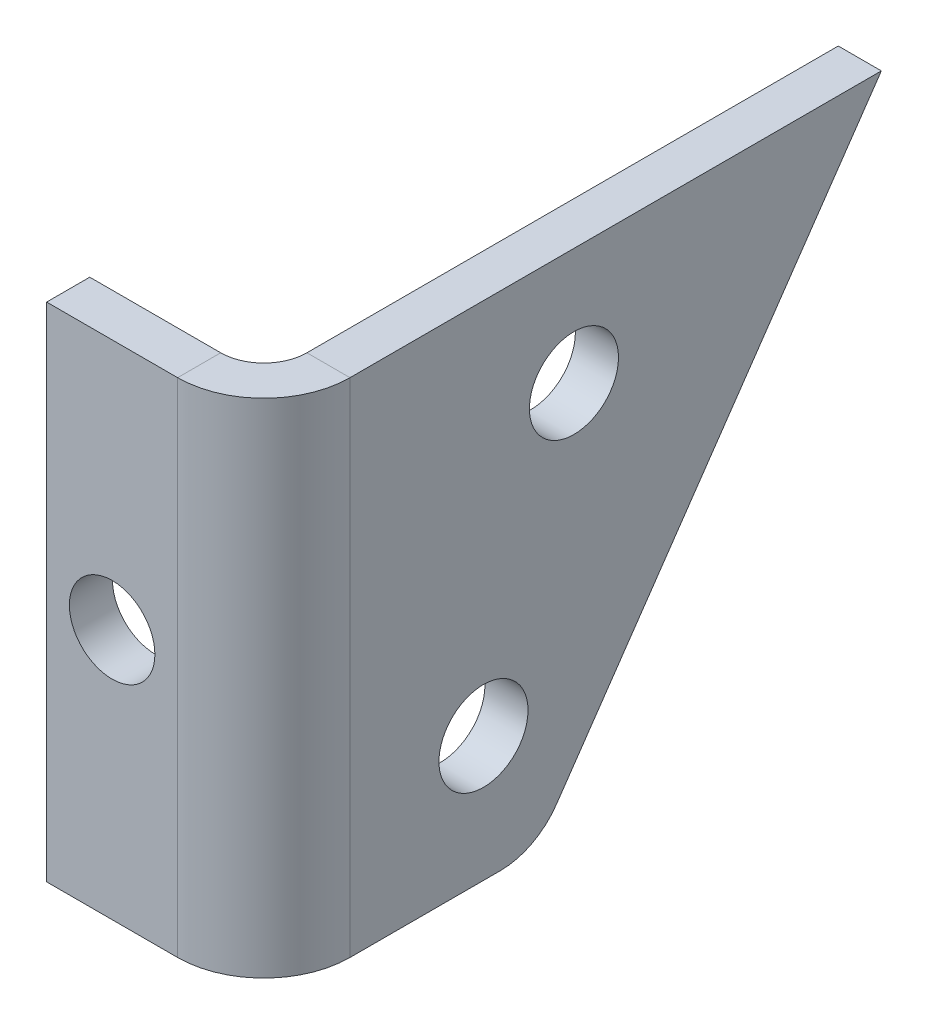
ISO-10303-21;
HEADER;
FILE_DESCRIPTION(('STEP AP214'),'2;1');
FILE_NAME('part.step','',(''),(''),'','','');
FILE_SCHEMA(('AUTOMOTIVE_DESIGN { 1 0 10303 214 1 1 1 1 }'));
ENDSEC;
DATA;
#1=APPLICATION_CONTEXT('core data for automotive mechanical design processes');
#2=APPLICATION_PROTOCOL_DEFINITION('international standard','automotive_design',2000,#1);
#3=PRODUCT_CONTEXT('',#1,'mechanical');
#4=PRODUCT('Part','Part','',(#3));
#5=PRODUCT_RELATED_PRODUCT_CATEGORY('part','',(#4));
#6=PRODUCT_DEFINITION_FORMATION('','',#4);
#7=PRODUCT_DEFINITION_CONTEXT('part definition',#1,'design');
#8=PRODUCT_DEFINITION('design','',#6,#7);
#9=PRODUCT_DEFINITION_SHAPE('','',#8);
#10=(LENGTH_UNIT() NAMED_UNIT(*) SI_UNIT(.MILLI.,.METRE.));
#11=(NAMED_UNIT(*) PLANE_ANGLE_UNIT() SI_UNIT($,.RADIAN.));
#12=(NAMED_UNIT(*) SI_UNIT($,.STERADIAN.) SOLID_ANGLE_UNIT());
#13=UNCERTAINTY_MEASURE_WITH_UNIT(LENGTH_MEASURE(1.E-05),#10,'distance_accuracy_value','');
#14=(GEOMETRIC_REPRESENTATION_CONTEXT(3) GLOBAL_UNCERTAINTY_ASSIGNED_CONTEXT((#13)) GLOBAL_UNIT_ASSIGNED_CONTEXT((#10,
#11,#12)) REPRESENTATION_CONTEXT('',''));
#15=CARTESIAN_POINT('',(0.,0.,0.));
#16=DIRECTION('',(0.,0.,1.));
#17=DIRECTION('',(1.,0.,0.));
#18=AXIS2_PLACEMENT_3D('',#15,#16,#17);
#19=CARTESIAN_POINT('',(-3.175,37.,-50.1590545460921));
#20=DIRECTION('',(0.,1.,0.));
#21=DIRECTION('',(0.,0.,1.));
#22=AXIS2_PLACEMENT_3D('',#19,#20,#21);
#23=PLANE('',#22);
#24=DIRECTION('',(0.,0.,1.));
#25=VECTOR('',#24,1.);
#26=CARTESIAN_POINT('',(-3.175,37.,-50.1590545460921));
#27=LINE('',#26,#25);
#28=CARTESIAN_POINT('',(-3.175,37.,-95.6605073025976));
#29=VERTEX_POINT('',#28);
#30=CARTESIAN_POINT('',(-3.17499999999999,37.,-56.5090545460921));
#31=VERTEX_POINT('',#30);
#32=EDGE_CURVE('E228',#29,#31,#27,.T.);
#33=ORIENTED_EDGE('',*,*,#32,.T.);
#34=DIRECTION('',(1.,0.,0.));
#35=VECTOR('',#34,1.);
#36=CARTESIAN_POINT('',(-3.17499999999999,37.,-56.5090545460921));
#37=LINE('',#36,#35);
#38=CARTESIAN_POINT('',(0.,37.,-56.5090545460921));
#39=VERTEX_POINT('',#38);
#40=EDGE_CURVE('E198',#31,#39,#37,.T.);
#41=ORIENTED_EDGE('',*,*,#40,.T.);
#42=DIRECTION('',(0.,0.,1.));
#43=VECTOR('',#42,1.);
#44=CARTESIAN_POINT('',(0.,37.,-50.1590545460921));
#45=LINE('',#44,#43);
#46=CARTESIAN_POINT('',(0.,37.,-95.6605073025976));
#47=VERTEX_POINT('',#46);
#48=EDGE_CURVE('E223',#47,#39,#45,.T.);
#49=ORIENTED_EDGE('',*,*,#48,.F.);
#50=DIRECTION('',(1.,0.,0.));
#51=VECTOR('',#50,1.);
#52=CARTESIAN_POINT('',(-3.175,37.,-95.6605073025976));
#53=LINE('',#52,#51);
#54=EDGE_CURVE('E13',#29,#47,#53,.T.);
#55=ORIENTED_EDGE('',*,*,#54,.F.);
#56=EDGE_LOOP('',(#33,#41,#49,#55));
#57=FACE_BOUND('',#56,.T.);
#58=ADVANCED_FACE('F63',(#57),#23,.T.);
#59=CARTESIAN_POINT('',(-3.175,5.00000000000016,-67.5979092718288));
#60=DIRECTION('',(1.,0.,0.));
#61=DIRECTION('',(0.,0.,-1.));
#62=AXIS2_PLACEMENT_3D('',#59,#60,#61);
#63=PLANE('',#62);
#64=CARTESIAN_POINT('',(-3.175,28.4055664108271,-73.0098549934206));
#65=DIRECTION('',(1.,0.,0.));
#66=DIRECTION('',(0.,0.,-1.));
#67=AXIS2_PLACEMENT_3D('',#64,#65,#66);
#68=CIRCLE('',#67,3.28245761780859);
#69=CARTESIAN_POINT('',(-3.175,28.4055664108271,-76.2923126112292));
#70=VERTEX_POINT('',#69);
#71=EDGE_CURVE('E215',#70,#70,#68,.T.);
#72=ORIENTED_EDGE('',*,*,#71,.T.);
#73=EDGE_LOOP('',(#72));
#74=FACE_BOUND('',#73,.T.);
#75=CARTESIAN_POINT('',(-3.175,9.22229452648841,-66.344990454787));
#76=DIRECTION('',(1.,0.,0.));
#77=DIRECTION('',(0.,0.,-1.));
#78=AXIS2_PLACEMENT_3D('',#75,#76,#77);
#79=CIRCLE('',#78,3.28245761780857);
#80=CARTESIAN_POINT('',(-3.175,9.22229452648841,-69.6274480725955));
#81=VERTEX_POINT('',#80);
#82=EDGE_CURVE('E209',#81,#81,#79,.T.);
#83=ORIENTED_EDGE('',*,*,#82,.T.);
#84=EDGE_LOOP('',(#83));
#85=FACE_BOUND('',#84,.T.);
#86=DIRECTION('',(0.,1.,0.));
#87=VECTOR('',#86,1.);
#88=CARTESIAN_POINT('',(-3.17499999999999,37.,-56.5090545460921));
#89=LINE('',#88,#87);
#90=CARTESIAN_POINT('',(-3.17499999999999,0.,-56.5090545460921));
#91=VERTEX_POINT('',#90);
#92=EDGE_CURVE('E202',#31,#91,#89,.F.);
#93=ORIENTED_EDGE('',*,*,#92,.F.);
#94=ORIENTED_EDGE('',*,*,#32,.F.);
#95=DIRECTION('',(0.,0.824097746308315,-0.566447618522274));
#96=VECTOR('',#95,1.);
#97=CARTESIAN_POINT('',(-3.175,2.16776190738873,-71.7183980033704));
#98=LINE('',#97,#96);
#99=CARTESIAN_POINT('',(-3.175,2.16776190738873,-71.7183980033704));
#100=VERTEX_POINT('',#99);
#101=EDGE_CURVE('E226',#100,#29,#98,.T.);
#102=ORIENTED_EDGE('',*,*,#101,.F.);
#103=CARTESIAN_POINT('',(-3.175,5.00000000000016,-67.5979092718288));
#104=DIRECTION('',(1.,0.,0.));
#105=DIRECTION('',(0.,0.,-1.));
#106=AXIS2_PLACEMENT_3D('',#103,#104,#105);
#107=CIRCLE('',#106,5.00000000000001);
#108=CARTESIAN_POINT('',(-3.175,1.47451495458029E-13,-67.5979092718288));
#109=VERTEX_POINT('',#108);
#110=EDGE_CURVE('E222',#109,#100,#107,.T.);
#111=ORIENTED_EDGE('',*,*,#110,.F.);
#112=DIRECTION('',(0.,0.,-1.));
#113=VECTOR('',#112,1.);
#114=CARTESIAN_POINT('',(-3.175,0.,-50.1590545460921));
#115=LINE('',#114,#113);
#116=EDGE_CURVE('E109',#91,#109,#115,.T.);
#117=ORIENTED_EDGE('',*,*,#116,.F.);
#118=EDGE_LOOP('',(#93,#94,#102,#111,#117));
#119=FACE_BOUND('',#118,.T.);
#120=ADVANCED_FACE('F251',(#74,#85,#119),#63,.F.);
#121=CARTESIAN_POINT('',(0.,5.00000000000016,-67.5979092718288));
#122=DIRECTION('',(1.,0.,0.));
#123=DIRECTION('',(0.,0.,-1.));
#124=AXIS2_PLACEMENT_3D('',#121,#122,#123);
#125=PLANE('',#124);
#126=CARTESIAN_POINT('',(0.,9.22229452648841,-66.344990454787));
#127=DIRECTION('',(1.,0.,0.));
#128=DIRECTION('',(0.,0.,-1.));
#129=AXIS2_PLACEMENT_3D('',#126,#127,#128);
#130=CIRCLE('',#129,3.28245761780857);
#131=CARTESIAN_POINT('',(0.,9.22229452648841,-69.6274480725955));
#132=VERTEX_POINT('',#131);
#133=EDGE_CURVE('E207',#132,#132,#130,.T.);
#134=ORIENTED_EDGE('',*,*,#133,.F.);
#135=EDGE_LOOP('',(#134));
#136=FACE_BOUND('',#135,.T.);
#137=CARTESIAN_POINT('',(0.,28.4055664108271,-73.0098549934206));
#138=DIRECTION('',(1.,0.,0.));
#139=DIRECTION('',(0.,0.,-1.));
#140=AXIS2_PLACEMENT_3D('',#137,#138,#139);
#141=CIRCLE('',#140,3.28245761780859);
#142=CARTESIAN_POINT('',(0.,28.4055664108271,-76.2923126112292));
#143=VERTEX_POINT('',#142);
#144=EDGE_CURVE('E212',#143,#143,#141,.T.);
#145=ORIENTED_EDGE('',*,*,#144,.F.);
#146=EDGE_LOOP('',(#145));
#147=FACE_BOUND('',#146,.T.);
#148=ORIENTED_EDGE('',*,*,#48,.T.);
#149=DIRECTION('',(0.,1.,0.));
#150=VECTOR('',#149,1.);
#151=CARTESIAN_POINT('',(0.,37.,-56.5090545460921));
#152=LINE('',#151,#150);
#153=CARTESIAN_POINT('',(0.,0.,-56.5090545460921));
#154=VERTEX_POINT('',#153);
#155=EDGE_CURVE('E148',#39,#154,#152,.F.);
#156=ORIENTED_EDGE('',*,*,#155,.T.);
#157=DIRECTION('',(0.,0.,-1.));
#158=VECTOR('',#157,1.);
#159=CARTESIAN_POINT('',(0.,0.,-50.1590545460921));
#160=LINE('',#159,#158);
#161=CARTESIAN_POINT('',(0.,1.47451495458029E-13,-67.5979092718288));
#162=VERTEX_POINT('',#161);
#163=EDGE_CURVE('E218',#154,#162,#160,.T.);
#164=ORIENTED_EDGE('',*,*,#163,.T.);
#165=CARTESIAN_POINT('',(0.,5.00000000000016,-67.5979092718288));
#166=DIRECTION('',(1.,0.,0.));
#167=DIRECTION('',(0.,0.,-1.));
#168=AXIS2_PLACEMENT_3D('',#165,#166,#167);
#169=CIRCLE('',#168,5.00000000000001);
#170=CARTESIAN_POINT('',(0.,2.16776190738873,-71.7183980033704));
#171=VERTEX_POINT('',#170);
#172=EDGE_CURVE('E231',#162,#171,#169,.T.);
#173=ORIENTED_EDGE('',*,*,#172,.T.);
#174=DIRECTION('',(0.,0.824097746308315,-0.566447618522274));
#175=VECTOR('',#174,1.);
#176=CARTESIAN_POINT('',(0.,2.16776190738873,-71.7183980033704));
#177=LINE('',#176,#175);
#178=EDGE_CURVE('E234',#171,#47,#177,.T.);
#179=ORIENTED_EDGE('',*,*,#178,.T.);
#180=EDGE_LOOP('',(#148,#156,#164,#173,#179));
#181=FACE_BOUND('',#180,.T.);
#182=ADVANCED_FACE('F244',(#136,#147,#181),#125,.T.);
#183=CARTESIAN_POINT('',(-3.175,0.,-50.1590545460921));
#184=DIRECTION('',(0.,-1.,0.));
#185=DIRECTION('',(0.,0.,-1.));
#186=AXIS2_PLACEMENT_3D('',#183,#184,#185);
#187=PLANE('',#186);
#188=DIRECTION('',(1.,0.,0.));
#189=VECTOR('',#188,1.);
#190=CARTESIAN_POINT('',(-3.17499999999999,0.,-56.5090545460921));
#191=LINE('',#190,#189);
#192=EDGE_CURVE('E205',#91,#154,#191,.T.);
#193=ORIENTED_EDGE('',*,*,#192,.F.);
#194=ORIENTED_EDGE('',*,*,#116,.T.);
#195=DIRECTION('',(1.,0.,0.));
#196=VECTOR('',#195,1.);
#197=CARTESIAN_POINT('',(-3.175,1.47451495458029E-13,-67.5979092718288));
#198=LINE('',#197,#196);
#199=EDGE_CURVE('E67',#109,#162,#198,.T.);
#200=ORIENTED_EDGE('',*,*,#199,.T.);
#201=ORIENTED_EDGE('',*,*,#163,.F.);
#202=EDGE_LOOP('',(#193,#194,#200,#201));
#203=FACE_BOUND('',#202,.T.);
#204=ADVANCED_FACE('F65',(#203),#187,.T.);
#205=CARTESIAN_POINT('',(-3.175,2.16776190738873,-71.7183980033704));
#206=DIRECTION('',(0.,-0.566447618522274,-0.824097746308315));
#207=DIRECTION('',(0.,0.824097746308315,-0.566447618522274));
#208=AXIS2_PLACEMENT_3D('',#205,#206,#207);
#209=PLANE('',#208);
#210=ORIENTED_EDGE('',*,*,#178,.F.);
#211=DIRECTION('',(1.,0.,0.));
#212=VECTOR('',#211,1.);
#213=CARTESIAN_POINT('',(-3.175,2.16776190738873,-71.7183980033704));
#214=LINE('',#213,#212);
#215=EDGE_CURVE('E72',#100,#171,#214,.T.);
#216=ORIENTED_EDGE('',*,*,#215,.F.);
#217=ORIENTED_EDGE('',*,*,#101,.T.);
#218=ORIENTED_EDGE('',*,*,#54,.T.);
#219=EDGE_LOOP('',(#210,#216,#217,#218));
#220=FACE_BOUND('',#219,.T.);
#221=ADVANCED_FACE('F253',(#220),#209,.T.);
#222=CARTESIAN_POINT('',(-3.175,5.00000000000016,-67.5979092718288));
#223=DIRECTION('',(1.,0.,0.));
#224=DIRECTION('',(0.,0.,-1.));
#225=AXIS2_PLACEMENT_3D('',#222,#223,#224);
#226=CYLINDRICAL_SURFACE('',#225,5.00000000000001);
#227=ORIENTED_EDGE('',*,*,#172,.F.);
#228=ORIENTED_EDGE('',*,*,#199,.F.);
#229=ORIENTED_EDGE('',*,*,#110,.T.);
#230=ORIENTED_EDGE('',*,*,#215,.T.);
#231=EDGE_LOOP('',(#227,#228,#229,#230));
#232=FACE_BOUND('',#231,.T.);
#233=ADVANCED_FACE('F242',(#232),#226,.T.);
#234=CARTESIAN_POINT('',(-3.175,28.4055664108271,-73.0098549934206));
#235=DIRECTION('',(1.,0.,0.));
#236=DIRECTION('',(0.,0.,-1.));
#237=AXIS2_PLACEMENT_3D('',#234,#235,#236);
#238=CYLINDRICAL_SURFACE('',#237,3.28245761780859);
#239=ORIENTED_EDGE('',*,*,#71,.F.);
#240=EDGE_LOOP('',(#239));
#241=FACE_BOUND('',#240,.T.);
#242=ORIENTED_EDGE('',*,*,#144,.T.);
#243=EDGE_LOOP('',(#242));
#244=FACE_BOUND('',#243,.T.);
#245=ADVANCED_FACE('F259',(#241,#244),#238,.F.);
#246=CARTESIAN_POINT('',(-3.175,9.22229452648841,-66.344990454787));
#247=DIRECTION('',(1.,0.,0.));
#248=DIRECTION('',(0.,0.,-1.));
#249=AXIS2_PLACEMENT_3D('',#246,#247,#248);
#250=CYLINDRICAL_SURFACE('',#249,3.28245761780857);
#251=ORIENTED_EDGE('',*,*,#82,.F.);
#252=EDGE_LOOP('',(#251));
#253=FACE_BOUND('',#252,.T.);
#254=ORIENTED_EDGE('',*,*,#133,.T.);
#255=EDGE_LOOP('',(#254));
#256=FACE_BOUND('',#255,.T.);
#257=ADVANCED_FACE('F275',(#253,#256),#250,.F.);
#258=CARTESIAN_POINT('',(-6.34999999999999,0.,-56.5090545460921));
#259=DIRECTION('',(0.,-1.,0.));
#260=DIRECTION('',(0.,0.,-1.));
#261=AXIS2_PLACEMENT_3D('',#258,#259,#260);
#262=PLANE('',#261);
#263=DIRECTION('',(0.,0.,1.));
#264=VECTOR('',#263,1.);
#265=CARTESIAN_POINT('',(-6.34999999999999,0.,-50.159054546092));
#266=LINE('',#265,#264);
#267=CARTESIAN_POINT('',(-6.34999999999998,0.,-53.3340545460921));
#268=VERTEX_POINT('',#267);
#269=CARTESIAN_POINT('',(-6.34999999999997,0.,-50.1590545460921));
#270=VERTEX_POINT('',#269);
#271=EDGE_CURVE('E193',#268,#270,#266,.T.);
#272=ORIENTED_EDGE('',*,*,#271,.F.);
#273=CARTESIAN_POINT('',(-6.34999999999999,0.,-56.5090545460921));
#274=DIRECTION('',(0.,1.,0.));
#275=DIRECTION('',(0.,0.,1.));
#276=AXIS2_PLACEMENT_3D('',#273,#274,#275);
#277=CIRCLE('',#276,3.175);
#278=EDGE_CURVE('E151',#91,#268,#277,.F.);
#279=ORIENTED_EDGE('',*,*,#278,.F.);
#280=ORIENTED_EDGE('',*,*,#192,.T.);
#281=CARTESIAN_POINT('',(-6.34999999999999,0.,-56.5090545460921));
#282=DIRECTION('',(0.,1.,0.));
#283=DIRECTION('',(0.,0.,1.));
#284=AXIS2_PLACEMENT_3D('',#281,#282,#283);
#285=CIRCLE('',#284,6.35);
#286=EDGE_CURVE('E80',#154,#270,#285,.F.);
#287=ORIENTED_EDGE('',*,*,#286,.T.);
#288=EDGE_LOOP('',(#272,#279,#280,#287));
#289=FACE_BOUND('',#288,.T.);
#290=ADVANCED_FACE('F278',(#289),#262,.T.);
#291=CARTESIAN_POINT('',(-6.34999999999999,37.,-56.5090545460921));
#292=DIRECTION('',(0.,-1.,0.));
#293=DIRECTION('',(0.,0.,-1.));
#294=AXIS2_PLACEMENT_3D('',#291,#292,#293);
#295=PLANE('',#294);
#296=CARTESIAN_POINT('',(-6.34999999999999,37.,-56.5090545460921));
#297=DIRECTION('',(0.,1.,0.));
#298=DIRECTION('',(0.,0.,1.));
#299=AXIS2_PLACEMENT_3D('',#296,#297,#298);
#300=CIRCLE('',#299,3.175);
#301=CARTESIAN_POINT('',(-6.34999999999998,37.,-53.3340545460921));
#302=VERTEX_POINT('',#301);
#303=EDGE_CURVE('E158',#302,#31,#300,.T.);
#304=ORIENTED_EDGE('',*,*,#303,.F.);
#305=DIRECTION('',(0.,0.,1.));
#306=VECTOR('',#305,1.);
#307=CARTESIAN_POINT('',(-6.34999999999999,37.,-53.3340545460921));
#308=LINE('',#307,#306);
#309=CARTESIAN_POINT('',(-6.34999999999999,37.,-50.1590545460921));
#310=VERTEX_POINT('',#309);
#311=EDGE_CURVE('E155',#302,#310,#308,.T.);
#312=ORIENTED_EDGE('',*,*,#311,.T.);
#313=CARTESIAN_POINT('',(-6.34999999999999,37.,-56.5090545460921));
#314=DIRECTION('',(0.,1.,0.));
#315=DIRECTION('',(0.,0.,1.));
#316=AXIS2_PLACEMENT_3D('',#313,#314,#315);
#317=CIRCLE('',#316,6.35);
#318=EDGE_CURVE('E142',#310,#39,#317,.T.);
#319=ORIENTED_EDGE('',*,*,#318,.T.);
#320=ORIENTED_EDGE('',*,*,#40,.F.);
#321=EDGE_LOOP('',(#304,#312,#319,#320));
#322=FACE_BOUND('',#321,.T.);
#323=ADVANCED_FACE('F156',(#322),#295,.F.);
#324=CARTESIAN_POINT('',(-6.34999999999999,37.,-56.5090545460921));
#325=DIRECTION('',(0.,1.,0.));
#326=DIRECTION('',(0.,0.,1.));
#327=AXIS2_PLACEMENT_3D('',#324,#325,#326);
#328=CYLINDRICAL_SURFACE('',#327,6.35);
#329=ORIENTED_EDGE('',*,*,#155,.F.);
#330=ORIENTED_EDGE('',*,*,#318,.F.);
#331=DIRECTION('',(0.,1.,0.));
#332=VECTOR('',#331,1.);
#333=CARTESIAN_POINT('',(-6.34999999999999,0.,-50.1590545460921));
#334=LINE('',#333,#332);
#335=EDGE_CURVE('E146',#270,#310,#334,.T.);
#336=ORIENTED_EDGE('',*,*,#335,.F.);
#337=ORIENTED_EDGE('',*,*,#286,.F.);
#338=EDGE_LOOP('',(#329,#330,#336,#337));
#339=FACE_BOUND('',#338,.T.);
#340=ADVANCED_FACE('F144',(#339),#328,.T.);
#341=CARTESIAN_POINT('',(-6.34999999999999,37.,-56.5090545460921));
#342=DIRECTION('',(0.,1.,0.));
#343=DIRECTION('',(0.,0.,1.));
#344=AXIS2_PLACEMENT_3D('',#341,#342,#343);
#345=CYLINDRICAL_SURFACE('',#344,3.175);
#346=ORIENTED_EDGE('',*,*,#92,.T.);
#347=ORIENTED_EDGE('',*,*,#278,.T.);
#348=DIRECTION('',(0.,-1.,0.));
#349=VECTOR('',#348,1.);
#350=CARTESIAN_POINT('',(-6.34999999999999,0.,-53.3340545460921));
#351=LINE('',#350,#349);
#352=EDGE_CURVE('E163',#268,#302,#351,.F.);
#353=ORIENTED_EDGE('',*,*,#352,.T.);
#354=ORIENTED_EDGE('',*,*,#303,.T.);
#355=EDGE_LOOP('',(#346,#347,#353,#354));
#356=FACE_BOUND('',#355,.T.);
#357=ADVANCED_FACE('F247',(#356),#345,.F.);
#358=CARTESIAN_POINT('',(-3.17499999999999,37.,-50.1590545460921));
#359=DIRECTION('',(0.,1.,0.));
#360=DIRECTION('',(0.,0.,1.));
#361=AXIS2_PLACEMENT_3D('',#358,#359,#360);
#362=PLANE('',#361);
#363=DIRECTION('',(1.,0.,0.));
#364=VECTOR('',#363,1.);
#365=CARTESIAN_POINT('',(-3.17499999999999,37.,-50.1590545460921));
#366=LINE('',#365,#364);
#367=CARTESIAN_POINT('',(-16.,37.,-50.159054546092));
#368=VERTEX_POINT('',#367);
#369=EDGE_CURVE('E170',#368,#310,#366,.T.);
#370=ORIENTED_EDGE('',*,*,#369,.T.);
#371=ORIENTED_EDGE('',*,*,#311,.F.);
#372=DIRECTION('',(-1.,0.,0.));
#373=VECTOR('',#372,1.);
#374=CARTESIAN_POINT('',(-1.62829641083335E-13,37.,-53.3340545460921));
#375=LINE('',#374,#373);
#376=CARTESIAN_POINT('',(-16.,37.,-53.334054546092));
#377=VERTEX_POINT('',#376);
#378=EDGE_CURVE('E186',#377,#302,#375,.F.);
#379=ORIENTED_EDGE('',*,*,#378,.F.);
#380=DIRECTION('',(0.,0.,-1.));
#381=VECTOR('',#380,1.);
#382=CARTESIAN_POINT('',(-16.,37.,-50.159054546092));
#383=LINE('',#382,#381);
#384=EDGE_CURVE('E175',#368,#377,#383,.T.);
#385=ORIENTED_EDGE('',*,*,#384,.F.);
#386=EDGE_LOOP('',(#370,#371,#379,#385));
#387=FACE_BOUND('',#386,.T.);
#388=ADVANCED_FACE('F174',(#387),#362,.T.);
#389=CARTESIAN_POINT('',(-16.,0.,-50.159054546092));
#390=DIRECTION('',(0.,-1.,0.));
#391=DIRECTION('',(0.,0.,-1.));
#392=AXIS2_PLACEMENT_3D('',#389,#390,#391);
#393=PLANE('',#392);
#394=DIRECTION('',(1.,0.,0.));
#395=VECTOR('',#394,1.);
#396=CARTESIAN_POINT('',(-1.62829641083335E-13,0.,-53.3340545460921));
#397=LINE('',#396,#395);
#398=CARTESIAN_POINT('',(-16.,0.,-53.334054546092));
#399=VERTEX_POINT('',#398);
#400=EDGE_CURVE('E172',#268,#399,#397,.F.);
#401=ORIENTED_EDGE('',*,*,#400,.F.);
#402=ORIENTED_EDGE('',*,*,#271,.T.);
#403=DIRECTION('',(-1.,0.,0.));
#404=VECTOR('',#403,1.);
#405=CARTESIAN_POINT('',(-16.,0.,-50.159054546092));
#406=LINE('',#405,#404);
#407=CARTESIAN_POINT('',(-16.,0.,-50.159054546092));
#408=VERTEX_POINT('',#407);
#409=EDGE_CURVE('E171',#270,#408,#406,.T.);
#410=ORIENTED_EDGE('',*,*,#409,.T.);
#411=DIRECTION('',(0.,0.,-1.));
#412=VECTOR('',#411,1.);
#413=CARTESIAN_POINT('',(-16.,0.,-50.159054546092));
#414=LINE('',#413,#412);
#415=EDGE_CURVE('E177',#408,#399,#414,.T.);
#416=ORIENTED_EDGE('',*,*,#415,.T.);
#417=EDGE_LOOP('',(#401,#402,#410,#416));
#418=FACE_BOUND('',#417,.T.);
#419=ADVANCED_FACE('F289',(#418),#393,.T.);
#420=CARTESIAN_POINT('',(-1.51744187832508E-13,0.,-50.1590545460921));
#421=DIRECTION('',(0.,0.,1.));
#422=DIRECTION('',(1.,0.,0.));
#423=AXIS2_PLACEMENT_3D('',#420,#421,#422);
#424=PLANE('',#423);
#425=CARTESIAN_POINT('',(-11.175,18.5,-50.1590545460921));
#426=DIRECTION('',(0.,0.,1.));
#427=DIRECTION('',(1.,0.,0.));
#428=AXIS2_PLACEMENT_3D('',#425,#426,#427);
#429=CIRCLE('',#428,3.15);
#430=CARTESIAN_POINT('',(-8.025,18.5,-50.1590545460921));
#431=VERTEX_POINT('',#430);
#432=EDGE_CURVE('E196',#431,#431,#429,.T.);
#433=ORIENTED_EDGE('',*,*,#432,.F.);
#434=EDGE_LOOP('',(#433));
#435=FACE_BOUND('',#434,.T.);
#436=ORIENTED_EDGE('',*,*,#409,.F.);
#437=ORIENTED_EDGE('',*,*,#335,.T.);
#438=ORIENTED_EDGE('',*,*,#369,.F.);
#439=DIRECTION('',(0.,1.,0.));
#440=VECTOR('',#439,1.);
#441=CARTESIAN_POINT('',(-16.,37.,-50.159054546092));
#442=LINE('',#441,#440);
#443=EDGE_CURVE('E178',#408,#368,#442,.T.);
#444=ORIENTED_EDGE('',*,*,#443,.F.);
#445=EDGE_LOOP('',(#436,#437,#438,#444));
#446=FACE_BOUND('',#445,.T.);
#447=ADVANCED_FACE('F168',(#435,#446),#424,.T.);
#448=CARTESIAN_POINT('',(-1.62829641083335E-13,0.,-53.3340545460921));
#449=DIRECTION('',(0.,0.,1.));
#450=DIRECTION('',(1.,0.,0.));
#451=AXIS2_PLACEMENT_3D('',#448,#449,#450);
#452=PLANE('',#451);
#453=CARTESIAN_POINT('',(-11.175,18.5,-53.3340545460921));
#454=DIRECTION('',(0.,0.,-1.));
#455=DIRECTION('',(-1.,0.,0.));
#456=AXIS2_PLACEMENT_3D('',#453,#454,#455);
#457=CIRCLE('',#456,3.15);
#458=CARTESIAN_POINT('',(-14.325,18.5,-53.3340545460921));
#459=VERTEX_POINT('',#458);
#460=EDGE_CURVE('E316',#459,#459,#457,.T.);
#461=ORIENTED_EDGE('',*,*,#460,.F.);
#462=EDGE_LOOP('',(#461));
#463=FACE_BOUND('',#462,.T.);
#464=ORIENTED_EDGE('',*,*,#352,.F.);
#465=ORIENTED_EDGE('',*,*,#400,.T.);
#466=DIRECTION('',(0.,-1.,0.));
#467=VECTOR('',#466,1.);
#468=CARTESIAN_POINT('',(-16.,0.,-53.334054546092));
#469=LINE('',#468,#467);
#470=EDGE_CURVE('E188',#399,#377,#469,.F.);
#471=ORIENTED_EDGE('',*,*,#470,.T.);
#472=ORIENTED_EDGE('',*,*,#378,.T.);
#473=EDGE_LOOP('',(#464,#465,#471,#472));
#474=FACE_BOUND('',#473,.T.);
#475=ADVANCED_FACE('F297',(#463,#474),#452,.F.);
#476=CARTESIAN_POINT('',(-16.,37.,-50.159054546092));
#477=DIRECTION('',(-1.,0.,0.));
#478=DIRECTION('',(0.,0.,1.));
#479=AXIS2_PLACEMENT_3D('',#476,#477,#478);
#480=PLANE('',#479);
#481=ORIENTED_EDGE('',*,*,#470,.F.);
#482=ORIENTED_EDGE('',*,*,#415,.F.);
#483=ORIENTED_EDGE('',*,*,#443,.T.);
#484=ORIENTED_EDGE('',*,*,#384,.T.);
#485=EDGE_LOOP('',(#481,#482,#483,#484));
#486=FACE_BOUND('',#485,.T.);
#487=ADVANCED_FACE('F293',(#486),#480,.T.);
#488=CARTESIAN_POINT('',(-11.175,18.5,-43.3340545460921));
#489=DIRECTION('',(0.,0.,-1.));
#490=DIRECTION('',(-1.,0.,0.));
#491=AXIS2_PLACEMENT_3D('',#488,#489,#490);
#492=CYLINDRICAL_SURFACE('',#491,3.15);
#493=ORIENTED_EDGE('',*,*,#432,.T.);
#494=EDGE_LOOP('',(#493));
#495=FACE_BOUND('',#494,.T.);
#496=ORIENTED_EDGE('',*,*,#460,.T.);
#497=EDGE_LOOP('',(#496));
#498=FACE_BOUND('',#497,.T.);
#499=ADVANCED_FACE('F296',(#495,#498),#492,.F.);
#500=CLOSED_SHELL('',(#58,#120,#182,#204,#221,#233,#245,#257,#290,#323,#340,#357,#388,#419,#447,
#475,#487,#499));
#501=MANIFOLD_SOLID_BREP('B2',#500);
#502=ADVANCED_BREP_SHAPE_REPRESENTATION('',(#18,#501),#14);
#503=SHAPE_DEFINITION_REPRESENTATION(#9,#502);
ENDSEC;
END-ISO-10303-21;
